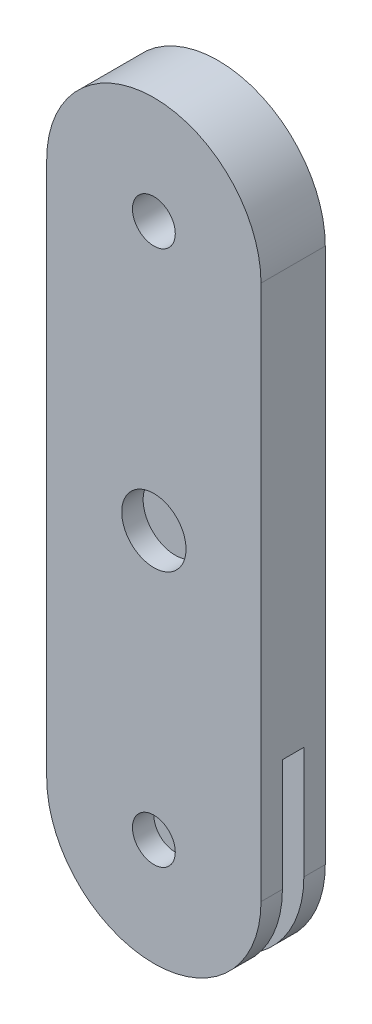
ISO-10303-21;
HEADER;
FILE_DESCRIPTION(('STEP AP214'),'2;1');
FILE_NAME('part.step','',(''),(''),'','','');
FILE_SCHEMA(('AUTOMOTIVE_DESIGN { 1 0 10303 214 1 1 1 1 }'));
ENDSEC;
DATA;
#1=APPLICATION_CONTEXT('core data for automotive mechanical design processes');
#2=APPLICATION_PROTOCOL_DEFINITION('international standard','automotive_design',2000,#1);
#3=PRODUCT_CONTEXT('',#1,'mechanical');
#4=PRODUCT('Part','Part','',(#3));
#5=PRODUCT_RELATED_PRODUCT_CATEGORY('part','',(#4));
#6=PRODUCT_DEFINITION_FORMATION('','',#4);
#7=PRODUCT_DEFINITION_CONTEXT('part definition',#1,'design');
#8=PRODUCT_DEFINITION('design','',#6,#7);
#9=PRODUCT_DEFINITION_SHAPE('','',#8);
#10=(LENGTH_UNIT() NAMED_UNIT(*) SI_UNIT(.MILLI.,.METRE.));
#11=(NAMED_UNIT(*) PLANE_ANGLE_UNIT() SI_UNIT($,.RADIAN.));
#12=(NAMED_UNIT(*) SI_UNIT($,.STERADIAN.) SOLID_ANGLE_UNIT());
#13=UNCERTAINTY_MEASURE_WITH_UNIT(LENGTH_MEASURE(1.E-05),#10,'distance_accuracy_value','');
#14=(GEOMETRIC_REPRESENTATION_CONTEXT(3) GLOBAL_UNCERTAINTY_ASSIGNED_CONTEXT((#13)) GLOBAL_UNIT_ASSIGNED_CONTEXT((#10,
#11,#12)) REPRESENTATION_CONTEXT('',''));
#15=CARTESIAN_POINT('',(0.,0.,0.));
#16=DIRECTION('',(0.,0.,1.));
#17=DIRECTION('',(1.,0.,0.));
#18=AXIS2_PLACEMENT_3D('',#15,#16,#17);
#19=CARTESIAN_POINT('',(50.,0.,-15.));
#20=DIRECTION('',(1.,0.,0.));
#21=DIRECTION('',(0.,1.,0.));
#22=AXIS2_PLACEMENT_3D('',#19,#20,#21);
#23=PLANE('',#22);
#24=DIRECTION('',(0.,0.,1.));
#25=VECTOR('',#24,1.);
#26=CARTESIAN_POINT('',(50.,-197.627691339575,-5.));
#27=LINE('',#26,#25);
#28=CARTESIAN_POINT('',(50.,-197.627691339575,-5.));
#29=VERTEX_POINT('',#28);
#30=CARTESIAN_POINT('',(50.,-197.627691339575,5.));
#31=VERTEX_POINT('',#30);
#32=EDGE_CURVE('E11',#29,#31,#27,.T.);
#33=ORIENTED_EDGE('',*,*,#32,.F.);
#34=DIRECTION('',(0.,1.,0.));
#35=VECTOR('',#34,1.);
#36=CARTESIAN_POINT('',(50.,-198.500950870954,-5.));
#37=LINE('',#36,#35);
#38=CARTESIAN_POINT('',(50.,-250.,-5.));
#39=VERTEX_POINT('',#38);
#40=EDGE_CURVE('E191',#39,#29,#37,.T.);
#41=ORIENTED_EDGE('',*,*,#40,.F.);
#42=DIRECTION('',(0.,0.,1.));
#43=VECTOR('',#42,1.);
#44=CARTESIAN_POINT('',(50.,-250.,-15.));
#45=LINE('',#44,#43);
#46=CARTESIAN_POINT('',(50.,-250.,-15.));
#47=VERTEX_POINT('',#46);
#48=EDGE_CURVE('E246',#47,#39,#45,.T.);
#49=ORIENTED_EDGE('',*,*,#48,.F.);
#50=DIRECTION('',(0.,1.,0.));
#51=VECTOR('',#50,1.);
#52=CARTESIAN_POINT('',(50.,0.,-15.));
#53=LINE('',#52,#51);
#54=CARTESIAN_POINT('',(50.,0.,-15.));
#55=VERTEX_POINT('',#54);
#56=EDGE_CURVE('E233',#47,#55,#53,.T.);
#57=ORIENTED_EDGE('',*,*,#56,.T.);
#58=DIRECTION('',(0.,0.,1.));
#59=VECTOR('',#58,1.);
#60=CARTESIAN_POINT('',(50.,0.,-15.));
#61=LINE('',#60,#59);
#62=CARTESIAN_POINT('',(50.,0.,15.));
#63=VERTEX_POINT('',#62);
#64=EDGE_CURVE('E55',#55,#63,#61,.T.);
#65=ORIENTED_EDGE('',*,*,#64,.T.);
#66=DIRECTION('',(0.,1.,0.));
#67=VECTOR('',#66,1.);
#68=CARTESIAN_POINT('',(50.,0.,15.));
#69=LINE('',#68,#67);
#70=CARTESIAN_POINT('',(50.,-250.,15.));
#71=VERTEX_POINT('',#70);
#72=EDGE_CURVE('E228',#71,#63,#69,.T.);
#73=ORIENTED_EDGE('',*,*,#72,.F.);
#74=CARTESIAN_POINT('',(50.,-250.,5.));
#75=VERTEX_POINT('',#74);
#76=EDGE_CURVE('E74',#75,#71,#45,.T.);
#77=ORIENTED_EDGE('',*,*,#76,.F.);
#78=DIRECTION('',(0.,-1.,0.));
#79=VECTOR('',#78,1.);
#80=CARTESIAN_POINT('',(50.,0.,5.));
#81=LINE('',#80,#79);
#82=EDGE_CURVE('E214',#31,#75,#81,.T.);
#83=ORIENTED_EDGE('',*,*,#82,.F.);
#84=EDGE_LOOP('',(#33,#41,#49,#57,#65,#73,#77,#83));
#85=FACE_BOUND('',#84,.T.);
#86=ADVANCED_FACE('F36',(#85),#23,.T.);
#87=CARTESIAN_POINT('',(0.,-250.,-15.));
#88=DIRECTION('',(0.,0.,1.));
#89=DIRECTION('',(1.,0.,0.));
#90=AXIS2_PLACEMENT_3D('',#87,#88,#89);
#91=CYLINDRICAL_SURFACE('',#90,50.);
#92=ORIENTED_EDGE('',*,*,#48,.T.);
#93=CARTESIAN_POINT('',(0.,-250.,-5.));
#94=DIRECTION('',(0.,0.,1.));
#95=DIRECTION('',(-1.,0.,0.));
#96=AXIS2_PLACEMENT_3D('',#93,#94,#95);
#97=CIRCLE('',#96,50.);
#98=CARTESIAN_POINT('',(-50.,-250.,-5.));
#99=VERTEX_POINT('',#98);
#100=EDGE_CURVE('E189',#99,#39,#97,.T.);
#101=ORIENTED_EDGE('',*,*,#100,.F.);
#102=DIRECTION('',(0.,0.,1.));
#103=VECTOR('',#102,1.);
#104=CARTESIAN_POINT('',(-50.,-250.,-15.));
#105=LINE('',#104,#103);
#106=CARTESIAN_POINT('',(-50.,-250.,-15.));
#107=VERTEX_POINT('',#106);
#108=EDGE_CURVE('E249',#107,#99,#105,.T.);
#109=ORIENTED_EDGE('',*,*,#108,.F.);
#110=CARTESIAN_POINT('',(0.,-250.,-15.));
#111=DIRECTION('',(0.,0.,1.));
#112=DIRECTION('',(-1.,0.,0.));
#113=AXIS2_PLACEMENT_3D('',#110,#111,#112);
#114=CIRCLE('',#113,50.);
#115=EDGE_CURVE('E230',#107,#47,#114,.T.);
#116=ORIENTED_EDGE('',*,*,#115,.T.);
#117=EDGE_LOOP('',(#92,#101,#109,#116));
#118=FACE_BOUND('',#117,.T.);
#119=ADVANCED_FACE('F322',(#118),#91,.T.);
#120=CARTESIAN_POINT('',(-50.,-250.,-15.));
#121=DIRECTION('',(-1.,0.,0.));
#122=DIRECTION('',(0.,0.,1.));
#123=AXIS2_PLACEMENT_3D('',#120,#121,#122);
#124=PLANE('',#123);
#125=ORIENTED_EDGE('',*,*,#108,.T.);
#126=DIRECTION('',(0.,1.,0.));
#127=VECTOR('',#126,1.);
#128=CARTESIAN_POINT('',(-50.,-250.,-5.));
#129=LINE('',#128,#127);
#130=CARTESIAN_POINT('',(-50.,-197.627691339575,-5.));
#131=VERTEX_POINT('',#130);
#132=EDGE_CURVE('E46',#99,#131,#129,.T.);
#133=ORIENTED_EDGE('',*,*,#132,.T.);
#134=DIRECTION('',(0.,0.,1.));
#135=VECTOR('',#134,1.);
#136=CARTESIAN_POINT('',(-50.,-197.627691339575,-5.));
#137=LINE('',#136,#135);
#138=CARTESIAN_POINT('',(-50.,-197.627691339575,5.));
#139=VERTEX_POINT('',#138);
#140=EDGE_CURVE('E255',#139,#131,#137,.F.);
#141=ORIENTED_EDGE('',*,*,#140,.F.);
#142=DIRECTION('',(0.,1.,0.));
#143=VECTOR('',#142,1.);
#144=CARTESIAN_POINT('',(-50.,-250.,5.));
#145=LINE('',#144,#143);
#146=CARTESIAN_POINT('',(-50.,-250.,5.));
#147=VERTEX_POINT('',#146);
#148=EDGE_CURVE('E245',#147,#139,#145,.T.);
#149=ORIENTED_EDGE('',*,*,#148,.F.);
#150=CARTESIAN_POINT('',(-50.,-250.,15.));
#151=VERTEX_POINT('',#150);
#152=EDGE_CURVE('E252',#147,#151,#105,.T.);
#153=ORIENTED_EDGE('',*,*,#152,.T.);
#154=DIRECTION('',(0.,-1.,0.));
#155=VECTOR('',#154,1.);
#156=CARTESIAN_POINT('',(-50.,-250.,15.));
#157=LINE('',#156,#155);
#158=CARTESIAN_POINT('',(-50.,0.,15.));
#159=VERTEX_POINT('',#158);
#160=EDGE_CURVE('E237',#159,#151,#157,.T.);
#161=ORIENTED_EDGE('',*,*,#160,.F.);
#162=DIRECTION('',(0.,0.,1.));
#163=VECTOR('',#162,1.);
#164=CARTESIAN_POINT('',(-50.,0.,-15.));
#165=LINE('',#164,#163);
#166=CARTESIAN_POINT('',(-50.,0.,-15.));
#167=VERTEX_POINT('',#166);
#168=EDGE_CURVE('E85',#167,#159,#165,.T.);
#169=ORIENTED_EDGE('',*,*,#168,.F.);
#170=DIRECTION('',(0.,-1.,0.));
#171=VECTOR('',#170,1.);
#172=CARTESIAN_POINT('',(-50.,-250.,-15.));
#173=LINE('',#172,#171);
#174=EDGE_CURVE('E227',#167,#107,#173,.T.);
#175=ORIENTED_EDGE('',*,*,#174,.T.);
#176=EDGE_LOOP('',(#125,#133,#141,#149,#153,#161,#169,#175));
#177=FACE_BOUND('',#176,.T.);
#178=ADVANCED_FACE('F292',(#177),#124,.T.);
#179=CARTESIAN_POINT('',(0.,0.,-15.));
#180=DIRECTION('',(0.,0.,1.));
#181=DIRECTION('',(1.,0.,0.));
#182=AXIS2_PLACEMENT_3D('',#179,#180,#181);
#183=CYLINDRICAL_SURFACE('',#182,50.);
#184=CARTESIAN_POINT('',(0.,0.,15.));
#185=DIRECTION('',(0.,0.,1.));
#186=DIRECTION('',(1.,0.,0.));
#187=AXIS2_PLACEMENT_3D('',#184,#185,#186);
#188=CIRCLE('',#187,50.);
#189=EDGE_CURVE('E224',#63,#159,#188,.T.);
#190=ORIENTED_EDGE('',*,*,#189,.F.);
#191=ORIENTED_EDGE('',*,*,#64,.F.);
#192=CARTESIAN_POINT('',(0.,0.,-15.));
#193=DIRECTION('',(0.,0.,1.));
#194=DIRECTION('',(1.,0.,0.));
#195=AXIS2_PLACEMENT_3D('',#192,#193,#194);
#196=CIRCLE('',#195,50.);
#197=EDGE_CURVE('E225',#55,#167,#196,.T.);
#198=ORIENTED_EDGE('',*,*,#197,.T.);
#199=ORIENTED_EDGE('',*,*,#168,.T.);
#200=EDGE_LOOP('',(#190,#191,#198,#199));
#201=FACE_BOUND('',#200,.T.);
#202=ADVANCED_FACE('F38',(#201),#183,.T.);
#203=CARTESIAN_POINT('',(0.,-250.,5.));
#204=DIRECTION('',(0.,0.,1.));
#205=DIRECTION('',(-1.,0.,0.));
#206=AXIS2_PLACEMENT_3D('',#203,#204,#205);
#207=CIRCLE('',#206,50.);
#208=EDGE_CURVE('E209',#147,#75,#207,.T.);
#209=ORIENTED_EDGE('',*,*,#208,.T.);
#210=ORIENTED_EDGE('',*,*,#76,.T.);
#211=CARTESIAN_POINT('',(0.,-250.,15.));
#212=DIRECTION('',(0.,0.,1.));
#213=DIRECTION('',(-1.,0.,0.));
#214=AXIS2_PLACEMENT_3D('',#211,#212,#213);
#215=CIRCLE('',#214,50.);
#216=EDGE_CURVE('E240',#151,#71,#215,.T.);
#217=ORIENTED_EDGE('',*,*,#216,.F.);
#218=ORIENTED_EDGE('',*,*,#152,.F.);
#219=EDGE_LOOP('',(#209,#210,#217,#218));
#220=FACE_BOUND('',#219,.T.);
#221=ADVANCED_FACE('F296',(#220),#91,.T.);
#222=CARTESIAN_POINT('',(0.,0.,-15.));
#223=DIRECTION('',(0.,0.,1.));
#224=DIRECTION('',(1.,0.,0.));
#225=AXIS2_PLACEMENT_3D('',#222,#223,#224);
#226=PLANE('',#225);
#227=CARTESIAN_POINT('',(0.,-250.,-15.));
#228=DIRECTION('',(0.,0.,1.));
#229=DIRECTION('',(1.,0.,0.));
#230=AXIS2_PLACEMENT_3D('',#227,#228,#229);
#231=CIRCLE('',#230,10.);
#232=CARTESIAN_POINT('',(10.,-250.,-15.));
#233=VERTEX_POINT('',#232);
#234=EDGE_CURVE('E504',#233,#233,#231,.T.);
#235=ORIENTED_EDGE('',*,*,#234,.T.);
#236=EDGE_LOOP('',(#235));
#237=FACE_BOUND('',#236,.T.);
#238=CARTESIAN_POINT('',(0.,0.,-15.));
#239=DIRECTION('',(0.,0.,1.));
#240=DIRECTION('',(1.,0.,0.));
#241=AXIS2_PLACEMENT_3D('',#238,#239,#240);
#242=CIRCLE('',#241,10.);
#243=CARTESIAN_POINT('',(10.,0.,-15.));
#244=VERTEX_POINT('',#243);
#245=EDGE_CURVE('E198',#244,#244,#242,.T.);
#246=ORIENTED_EDGE('',*,*,#245,.T.);
#247=EDGE_LOOP('',(#246));
#248=FACE_BOUND('',#247,.T.);
#249=ORIENTED_EDGE('',*,*,#197,.F.);
#250=ORIENTED_EDGE('',*,*,#56,.F.);
#251=ORIENTED_EDGE('',*,*,#115,.F.);
#252=ORIENTED_EDGE('',*,*,#174,.F.);
#253=EDGE_LOOP('',(#249,#250,#251,#252));
#254=FACE_BOUND('',#253,.T.);
#255=ADVANCED_FACE('F276',(#237,#248,#254),#226,.F.);
#256=CARTESIAN_POINT('',(0.,0.,15.));
#257=DIRECTION('',(0.,0.,1.));
#258=DIRECTION('',(1.,0.,0.));
#259=AXIS2_PLACEMENT_3D('',#256,#257,#258);
#260=PLANE('',#259);
#261=CARTESIAN_POINT('',(0.,-250.,15.));
#262=DIRECTION('',(0.,0.,1.));
#263=DIRECTION('',(1.,0.,0.));
#264=AXIS2_PLACEMENT_3D('',#261,#262,#263);
#265=CIRCLE('',#264,10.);
#266=CARTESIAN_POINT('',(10.,-250.,15.));
#267=VERTEX_POINT('',#266);
#268=EDGE_CURVE('E265',#267,#267,#265,.F.);
#269=ORIENTED_EDGE('',*,*,#268,.T.);
#270=EDGE_LOOP('',(#269));
#271=FACE_BOUND('',#270,.T.);
#272=CARTESIAN_POINT('',(0.,-125.,15.));
#273=DIRECTION('',(0.,0.,1.));
#274=DIRECTION('',(1.,0.,0.));
#275=AXIS2_PLACEMENT_3D('',#272,#273,#274);
#276=CIRCLE('',#275,15.);
#277=CARTESIAN_POINT('',(15.,-125.,15.));
#278=VERTEX_POINT('',#277);
#279=EDGE_CURVE('E260',#278,#278,#276,.T.);
#280=ORIENTED_EDGE('',*,*,#279,.F.);
#281=EDGE_LOOP('',(#280));
#282=FACE_BOUND('',#281,.T.);
#283=CARTESIAN_POINT('',(0.,0.,15.));
#284=DIRECTION('',(0.,0.,1.));
#285=DIRECTION('',(1.,0.,0.));
#286=AXIS2_PLACEMENT_3D('',#283,#284,#285);
#287=CIRCLE('',#286,10.);
#288=CARTESIAN_POINT('',(10.,0.,15.));
#289=VERTEX_POINT('',#288);
#290=EDGE_CURVE('E179',#289,#289,#287,.T.);
#291=ORIENTED_EDGE('',*,*,#290,.F.);
#292=EDGE_LOOP('',(#291));
#293=FACE_BOUND('',#292,.T.);
#294=ORIENTED_EDGE('',*,*,#189,.T.);
#295=ORIENTED_EDGE('',*,*,#160,.T.);
#296=ORIENTED_EDGE('',*,*,#216,.T.);
#297=ORIENTED_EDGE('',*,*,#72,.T.);
#298=EDGE_LOOP('',(#294,#295,#296,#297));
#299=FACE_BOUND('',#298,.T.);
#300=ADVANCED_FACE('F287',(#271,#282,#293,#299),#260,.T.);
#301=CARTESIAN_POINT('',(34.95,-56.8828326789236,-5.));
#302=DIRECTION('',(0.,0.,1.));
#303=DIRECTION('',(1.,0.,0.));
#304=AXIS2_PLACEMENT_3D('',#301,#302,#303);
#305=CYLINDRICAL_SURFACE('',#304,10.);
#306=CARTESIAN_POINT('',(34.95,-56.8828326789236,5.));
#307=DIRECTION('',(0.,0.,1.));
#308=DIRECTION('',(1.,0.,0.));
#309=AXIS2_PLACEMENT_3D('',#306,#307,#308);
#310=CIRCLE('',#309,10.);
#311=CARTESIAN_POINT('',(44.95,-56.8828326789237,5.));
#312=VERTEX_POINT('',#311);
#313=CARTESIAN_POINT('',(34.95,-46.8828326789236,5.));
#314=VERTEX_POINT('',#313);
#315=EDGE_CURVE('E156',#312,#314,#310,.T.);
#316=ORIENTED_EDGE('',*,*,#315,.T.);
#317=DIRECTION('',(0.,0.,1.));
#318=VECTOR('',#317,1.);
#319=CARTESIAN_POINT('',(34.95,-46.8828326789236,-5.));
#320=LINE('',#319,#318);
#321=CARTESIAN_POINT('',(34.95,-46.8828326789236,-5.));
#322=VERTEX_POINT('',#321);
#323=EDGE_CURVE('E149',#322,#314,#320,.T.);
#324=ORIENTED_EDGE('',*,*,#323,.F.);
#325=CARTESIAN_POINT('',(34.95,-56.8828326789236,-5.));
#326=DIRECTION('',(0.,0.,1.));
#327=DIRECTION('',(1.,0.,0.));
#328=AXIS2_PLACEMENT_3D('',#325,#326,#327);
#329=CIRCLE('',#328,10.);
#330=CARTESIAN_POINT('',(44.95,-56.8828326789237,-5.));
#331=VERTEX_POINT('',#330);
#332=EDGE_CURVE('E153',#331,#322,#329,.T.);
#333=ORIENTED_EDGE('',*,*,#332,.F.);
#334=DIRECTION('',(0.,0.,1.));
#335=VECTOR('',#334,1.);
#336=CARTESIAN_POINT('',(44.95,-56.8828326789237,-5.));
#337=LINE('',#336,#335);
#338=EDGE_CURVE('E212',#331,#312,#337,.T.);
#339=ORIENTED_EDGE('',*,*,#338,.T.);
#340=EDGE_LOOP('',(#316,#324,#333,#339));
#341=FACE_BOUND('',#340,.T.);
#342=ADVANCED_FACE('F151',(#341),#305,.F.);
#343=CARTESIAN_POINT('',(44.95,-184.342455173063,-5.));
#344=DIRECTION('',(1.,0.,0.));
#345=DIRECTION('',(0.,0.,-1.));
#346=AXIS2_PLACEMENT_3D('',#343,#344,#345);
#347=PLANE('',#346);
#348=DIRECTION('',(0.,1.,0.));
#349=VECTOR('',#348,1.);
#350=CARTESIAN_POINT('',(44.95,-184.342455173063,5.));
#351=LINE('',#350,#349);
#352=CARTESIAN_POINT('',(44.95,-184.342455173063,5.));
#353=VERTEX_POINT('',#352);
#354=EDGE_CURVE('E173',#353,#312,#351,.T.);
#355=ORIENTED_EDGE('',*,*,#354,.T.);
#356=ORIENTED_EDGE('',*,*,#338,.F.);
#357=DIRECTION('',(0.,1.,0.));
#358=VECTOR('',#357,1.);
#359=CARTESIAN_POINT('',(44.95,-184.342455173063,-5.));
#360=LINE('',#359,#358);
#361=CARTESIAN_POINT('',(44.95,-184.342455173063,-5.));
#362=VERTEX_POINT('',#361);
#363=EDGE_CURVE('E161',#362,#331,#360,.T.);
#364=ORIENTED_EDGE('',*,*,#363,.F.);
#365=DIRECTION('',(0.,0.,1.));
#366=VECTOR('',#365,1.);
#367=CARTESIAN_POINT('',(44.95,-184.342455173063,-5.));
#368=LINE('',#367,#366);
#369=EDGE_CURVE('E215',#362,#353,#368,.T.);
#370=ORIENTED_EDGE('',*,*,#369,.T.);
#371=EDGE_LOOP('',(#355,#356,#364,#370));
#372=FACE_BOUND('',#371,.T.);
#373=ADVANCED_FACE('F308',(#372),#347,.F.);
#374=CARTESIAN_POINT('',(64.95,-184.342455173063,-5.));
#375=DIRECTION('',(0.,0.,1.));
#376=DIRECTION('',(1.,0.,0.));
#377=AXIS2_PLACEMENT_3D('',#374,#375,#376);
#378=CYLINDRICAL_SURFACE('',#377,20.);
#379=ORIENTED_EDGE('',*,*,#32,.T.);
#380=CARTESIAN_POINT('',(64.95,-184.342455173063,5.));
#381=DIRECTION('',(0.,0.,-1.));
#382=DIRECTION('',(-1.,0.,0.));
#383=AXIS2_PLACEMENT_3D('',#380,#381,#382);
#384=CIRCLE('',#383,20.);
#385=EDGE_CURVE('E176',#31,#353,#384,.T.);
#386=ORIENTED_EDGE('',*,*,#385,.T.);
#387=ORIENTED_EDGE('',*,*,#369,.F.);
#388=CARTESIAN_POINT('',(64.95,-184.342455173063,-5.));
#389=DIRECTION('',(0.,0.,-1.));
#390=DIRECTION('',(-1.,0.,0.));
#391=AXIS2_PLACEMENT_3D('',#388,#389,#390);
#392=CIRCLE('',#391,20.);
#393=EDGE_CURVE('E193',#29,#362,#392,.T.);
#394=ORIENTED_EDGE('',*,*,#393,.F.);
#395=EDGE_LOOP('',(#379,#386,#387,#394));
#396=FACE_BOUND('',#395,.T.);
#397=ADVANCED_FACE('F305',(#396),#378,.T.);
#398=CARTESIAN_POINT('',(-64.95,-184.342455173063,-5.));
#399=DIRECTION('',(0.,0.,1.));
#400=DIRECTION('',(1.,0.,0.));
#401=AXIS2_PLACEMENT_3D('',#398,#399,#400);
#402=CYLINDRICAL_SURFACE('',#401,20.);
#403=ORIENTED_EDGE('',*,*,#140,.T.);
#404=CARTESIAN_POINT('',(-64.95,-184.342455173063,-5.));
#405=DIRECTION('',(0.,0.,-1.));
#406=DIRECTION('',(1.,0.,0.));
#407=AXIS2_PLACEMENT_3D('',#404,#405,#406);
#408=CIRCLE('',#407,20.);
#409=CARTESIAN_POINT('',(-44.95,-184.342455173063,-5.));
#410=VERTEX_POINT('',#409);
#411=EDGE_CURVE('E186',#410,#131,#408,.T.);
#412=ORIENTED_EDGE('',*,*,#411,.F.);
#413=DIRECTION('',(0.,0.,1.));
#414=VECTOR('',#413,1.);
#415=CARTESIAN_POINT('',(-44.95,-184.342455173063,-5.));
#416=LINE('',#415,#414);
#417=CARTESIAN_POINT('',(-44.95,-184.342455173063,5.));
#418=VERTEX_POINT('',#417);
#419=EDGE_CURVE('E218',#410,#418,#416,.T.);
#420=ORIENTED_EDGE('',*,*,#419,.T.);
#421=CARTESIAN_POINT('',(-64.95,-184.342455173063,5.));
#422=DIRECTION('',(0.,0.,-1.));
#423=DIRECTION('',(1.,0.,0.));
#424=AXIS2_PLACEMENT_3D('',#421,#422,#423);
#425=CIRCLE('',#424,20.);
#426=EDGE_CURVE('E206',#418,#139,#425,.T.);
#427=ORIENTED_EDGE('',*,*,#426,.T.);
#428=EDGE_LOOP('',(#403,#412,#420,#427));
#429=FACE_BOUND('',#428,.T.);
#430=ADVANCED_FACE('F319',(#429),#402,.T.);
#431=CARTESIAN_POINT('',(-44.95,-184.342455173063,-5.));
#432=DIRECTION('',(-1.,0.,0.));
#433=DIRECTION('',(0.,0.,1.));
#434=AXIS2_PLACEMENT_3D('',#431,#432,#433);
#435=PLANE('',#434);
#436=DIRECTION('',(0.,-1.,0.));
#437=VECTOR('',#436,1.);
#438=CARTESIAN_POINT('',(-44.95,-184.342455173063,5.));
#439=LINE('',#438,#437);
#440=CARTESIAN_POINT('',(-44.95,-56.8828326789237,5.));
#441=VERTEX_POINT('',#440);
#442=EDGE_CURVE('E203',#441,#418,#439,.T.);
#443=ORIENTED_EDGE('',*,*,#442,.T.);
#444=ORIENTED_EDGE('',*,*,#419,.F.);
#445=DIRECTION('',(0.,-1.,0.));
#446=VECTOR('',#445,1.);
#447=CARTESIAN_POINT('',(-44.95,-184.342455173063,-5.));
#448=LINE('',#447,#446);
#449=CARTESIAN_POINT('',(-44.95,-56.8828326789237,-5.));
#450=VERTEX_POINT('',#449);
#451=EDGE_CURVE('E183',#450,#410,#448,.T.);
#452=ORIENTED_EDGE('',*,*,#451,.F.);
#453=DIRECTION('',(0.,0.,1.));
#454=VECTOR('',#453,1.);
#455=CARTESIAN_POINT('',(-44.95,-56.8828326789237,-5.));
#456=LINE('',#455,#454);
#457=EDGE_CURVE('E220',#450,#441,#456,.T.);
#458=ORIENTED_EDGE('',*,*,#457,.T.);
#459=EDGE_LOOP('',(#443,#444,#452,#458));
#460=FACE_BOUND('',#459,.T.);
#461=ADVANCED_FACE('F317',(#460),#435,.F.);
#462=CARTESIAN_POINT('',(-34.95,-56.8828326789236,-5.));
#463=DIRECTION('',(0.,0.,1.));
#464=DIRECTION('',(1.,0.,0.));
#465=AXIS2_PLACEMENT_3D('',#462,#463,#464);
#466=CYLINDRICAL_SURFACE('',#465,10.);
#467=CARTESIAN_POINT('',(-34.95,-56.8828326789236,5.));
#468=DIRECTION('',(0.,0.,1.));
#469=DIRECTION('',(-1.,0.,0.));
#470=AXIS2_PLACEMENT_3D('',#467,#468,#469);
#471=CIRCLE('',#470,10.);
#472=CARTESIAN_POINT('',(-34.95,-46.8828326789236,5.));
#473=VERTEX_POINT('',#472);
#474=EDGE_CURVE('E200',#473,#441,#471,.T.);
#475=ORIENTED_EDGE('',*,*,#474,.T.);
#476=ORIENTED_EDGE('',*,*,#457,.F.);
#477=CARTESIAN_POINT('',(-34.95,-56.8828326789236,-5.));
#478=DIRECTION('',(0.,0.,1.));
#479=DIRECTION('',(-1.,0.,0.));
#480=AXIS2_PLACEMENT_3D('',#477,#478,#479);
#481=CIRCLE('',#480,10.);
#482=CARTESIAN_POINT('',(-34.95,-46.8828326789236,-5.));
#483=VERTEX_POINT('',#482);
#484=EDGE_CURVE('E169',#483,#450,#481,.T.);
#485=ORIENTED_EDGE('',*,*,#484,.F.);
#486=DIRECTION('',(0.,0.,1.));
#487=VECTOR('',#486,1.);
#488=CARTESIAN_POINT('',(-34.95,-46.8828326789236,-5.));
#489=LINE('',#488,#487);
#490=EDGE_CURVE('E160',#483,#473,#489,.T.);
#491=ORIENTED_EDGE('',*,*,#490,.T.);
#492=EDGE_LOOP('',(#475,#476,#485,#491));
#493=FACE_BOUND('',#492,.T.);
#494=ADVANCED_FACE('F313',(#493),#466,.F.);
#495=CARTESIAN_POINT('',(34.95,-46.8828326789236,-5.));
#496=DIRECTION('',(0.,1.,0.));
#497=DIRECTION('',(0.,0.,1.));
#498=AXIS2_PLACEMENT_3D('',#495,#496,#497);
#499=PLANE('',#498);
#500=DIRECTION('',(-1.,0.,0.));
#501=VECTOR('',#500,1.);
#502=CARTESIAN_POINT('',(34.95,-46.8828326789236,5.));
#503=LINE('',#502,#501);
#504=EDGE_CURVE('E197',#314,#473,#503,.T.);
#505=ORIENTED_EDGE('',*,*,#504,.T.);
#506=ORIENTED_EDGE('',*,*,#490,.F.);
#507=DIRECTION('',(-1.,0.,0.));
#508=VECTOR('',#507,1.);
#509=CARTESIAN_POINT('',(34.95,-46.8828326789236,-5.));
#510=LINE('',#509,#508);
#511=EDGE_CURVE('E164',#322,#483,#510,.T.);
#512=ORIENTED_EDGE('',*,*,#511,.F.);
#513=ORIENTED_EDGE('',*,*,#323,.T.);
#514=EDGE_LOOP('',(#505,#506,#512,#513));
#515=FACE_BOUND('',#514,.T.);
#516=ADVANCED_FACE('F165',(#515),#499,.F.);
#517=CARTESIAN_POINT('',(34.95,-56.8828326789236,-5.));
#518=DIRECTION('',(0.,0.,1.));
#519=DIRECTION('',(1.,0.,0.));
#520=AXIS2_PLACEMENT_3D('',#517,#518,#519);
#521=PLANE('',#520);
#522=CARTESIAN_POINT('',(0.,-250.,-5.));
#523=DIRECTION('',(0.,0.,1.));
#524=DIRECTION('',(1.,0.,0.));
#525=AXIS2_PLACEMENT_3D('',#522,#523,#524);
#526=CIRCLE('',#525,10.);
#527=CARTESIAN_POINT('',(10.,-250.,-5.));
#528=VERTEX_POINT('',#527);
#529=EDGE_CURVE('E270',#528,#528,#526,.F.);
#530=ORIENTED_EDGE('',*,*,#529,.T.);
#531=EDGE_LOOP('',(#530));
#532=FACE_BOUND('',#531,.T.);
#533=ORIENTED_EDGE('',*,*,#393,.T.);
#534=ORIENTED_EDGE('',*,*,#363,.T.);
#535=ORIENTED_EDGE('',*,*,#332,.T.);
#536=ORIENTED_EDGE('',*,*,#511,.T.);
#537=ORIENTED_EDGE('',*,*,#484,.T.);
#538=ORIENTED_EDGE('',*,*,#451,.T.);
#539=ORIENTED_EDGE('',*,*,#411,.T.);
#540=ORIENTED_EDGE('',*,*,#132,.F.);
#541=ORIENTED_EDGE('',*,*,#100,.T.);
#542=ORIENTED_EDGE('',*,*,#40,.T.);
#543=EDGE_LOOP('',(#533,#534,#535,#536,#537,#538,#539,#540,#541,#542));
#544=FACE_BOUND('',#543,.T.);
#545=ADVANCED_FACE('F171',(#532,#544),#521,.T.);
#546=CARTESIAN_POINT('',(34.95,-56.8828326789236,5.));
#547=DIRECTION('',(0.,0.,1.));
#548=DIRECTION('',(1.,0.,0.));
#549=AXIS2_PLACEMENT_3D('',#546,#547,#548);
#550=PLANE('',#549);
#551=CARTESIAN_POINT('',(0.,-250.,5.));
#552=DIRECTION('',(0.,0.,1.));
#553=DIRECTION('',(1.,0.,0.));
#554=AXIS2_PLACEMENT_3D('',#551,#552,#553);
#555=CIRCLE('',#554,10.);
#556=CARTESIAN_POINT('',(10.,-250.,5.));
#557=VERTEX_POINT('',#556);
#558=EDGE_CURVE('E40',#557,#557,#555,.F.);
#559=ORIENTED_EDGE('',*,*,#558,.F.);
#560=EDGE_LOOP('',(#559));
#561=FACE_BOUND('',#560,.T.);
#562=CARTESIAN_POINT('',(0.,-125.,5.));
#563=DIRECTION('',(0.,0.,1.));
#564=DIRECTION('',(1.,0.,0.));
#565=AXIS2_PLACEMENT_3D('',#562,#563,#564);
#566=CIRCLE('',#565,15.);
#567=CARTESIAN_POINT('',(15.,-125.,5.));
#568=VERTEX_POINT('',#567);
#569=EDGE_CURVE('E258',#568,#568,#566,.T.);
#570=ORIENTED_EDGE('',*,*,#569,.T.);
#571=EDGE_LOOP('',(#570));
#572=FACE_BOUND('',#571,.T.);
#573=ORIENTED_EDGE('',*,*,#82,.T.);
#574=ORIENTED_EDGE('',*,*,#208,.F.);
#575=ORIENTED_EDGE('',*,*,#148,.T.);
#576=ORIENTED_EDGE('',*,*,#426,.F.);
#577=ORIENTED_EDGE('',*,*,#442,.F.);
#578=ORIENTED_EDGE('',*,*,#474,.F.);
#579=ORIENTED_EDGE('',*,*,#504,.F.);
#580=ORIENTED_EDGE('',*,*,#315,.F.);
#581=ORIENTED_EDGE('',*,*,#354,.F.);
#582=ORIENTED_EDGE('',*,*,#385,.F.);
#583=EDGE_LOOP('',(#573,#574,#575,#576,#577,#578,#579,#580,#581,#582));
#584=FACE_BOUND('',#583,.T.);
#585=ADVANCED_FACE('F283',(#561,#572,#584),#550,.F.);
#586=CARTESIAN_POINT('',(0.,0.,-15.));
#587=DIRECTION('',(0.,0.,1.));
#588=DIRECTION('',(1.,0.,0.));
#589=AXIS2_PLACEMENT_3D('',#586,#587,#588);
#590=CYLINDRICAL_SURFACE('',#589,10.);
#591=ORIENTED_EDGE('',*,*,#245,.F.);
#592=EDGE_LOOP('',(#591));
#593=FACE_BOUND('',#592,.T.);
#594=ORIENTED_EDGE('',*,*,#290,.T.);
#595=EDGE_LOOP('',(#594));
#596=FACE_BOUND('',#595,.T.);
#597=ADVANCED_FACE('F279',(#593,#596),#590,.F.);
#598=CARTESIAN_POINT('',(0.,-125.,0.));
#599=DIRECTION('',(0.,0.,1.));
#600=DIRECTION('',(1.,0.,0.));
#601=AXIS2_PLACEMENT_3D('',#598,#599,#600);
#602=CYLINDRICAL_SURFACE('',#601,15.);
#603=ORIENTED_EDGE('',*,*,#279,.T.);
#604=EDGE_LOOP('',(#603));
#605=FACE_BOUND('',#604,.T.);
#606=ORIENTED_EDGE('',*,*,#569,.F.);
#607=EDGE_LOOP('',(#606));
#608=FACE_BOUND('',#607,.T.);
#609=ADVANCED_FACE('F282',(#605,#608),#602,.F.);
#610=CARTESIAN_POINT('',(0.,-250.,205.));
#611=DIRECTION('',(0.,0.,-1.));
#612=DIRECTION('',(-1.,0.,0.));
#613=AXIS2_PLACEMENT_3D('',#610,#611,#612);
#614=CYLINDRICAL_SURFACE('',#613,10.);
#615=ORIENTED_EDGE('',*,*,#268,.F.);
#616=EDGE_LOOP('',(#615));
#617=FACE_BOUND('',#616,.T.);
#618=ORIENTED_EDGE('',*,*,#558,.T.);
#619=EDGE_LOOP('',(#618));
#620=FACE_BOUND('',#619,.T.);
#621=ADVANCED_FACE('F459',(#617,#620),#614,.F.);
#622=ORIENTED_EDGE('',*,*,#529,.F.);
#623=EDGE_LOOP('',(#622));
#624=FACE_BOUND('',#623,.T.);
#625=ORIENTED_EDGE('',*,*,#234,.F.);
#626=EDGE_LOOP('',(#625));
#627=FACE_BOUND('',#626,.T.);
#628=ADVANCED_FACE('F466',(#624,#627),#614,.F.);
#629=CLOSED_SHELL('',(#86,#119,#178,#202,#221,#255,#300,#342,#373,#397,#430,#461,#494,#516,#545,
#585,#597,#609,#621,#628));
#630=MANIFOLD_SOLID_BREP('B2',#629);
#631=ADVANCED_BREP_SHAPE_REPRESENTATION('',(#18,#630),#14);
#632=SHAPE_DEFINITION_REPRESENTATION(#9,#631);
ENDSEC;
END-ISO-10303-21;
